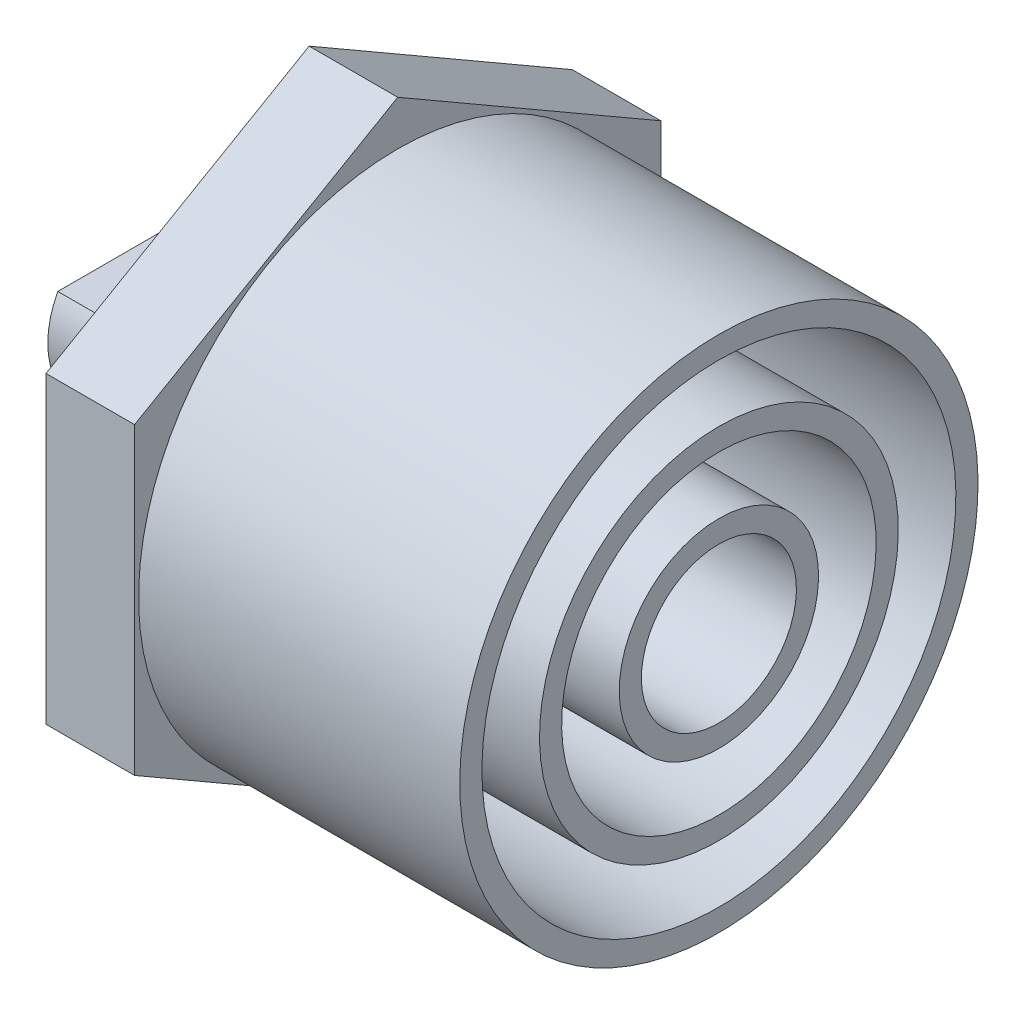
ISO-10303-21;
HEADER;
FILE_DESCRIPTION(('STEP AP214'),'2;1');
FILE_NAME('part.step','',(''),(''),'','','');
FILE_SCHEMA(('AUTOMOTIVE_DESIGN { 1 0 10303 214 1 1 1 1 }'));
ENDSEC;
DATA;
#1=APPLICATION_CONTEXT('core data for automotive mechanical design processes');
#2=APPLICATION_PROTOCOL_DEFINITION('international standard','automotive_design',2000,#1);
#3=PRODUCT_CONTEXT('',#1,'mechanical');
#4=PRODUCT('Part','Part','',(#3));
#5=PRODUCT_RELATED_PRODUCT_CATEGORY('part','',(#4));
#6=PRODUCT_DEFINITION_FORMATION('','',#4);
#7=PRODUCT_DEFINITION_CONTEXT('part definition',#1,'design');
#8=PRODUCT_DEFINITION('design','',#6,#7);
#9=PRODUCT_DEFINITION_SHAPE('','',#8);
#10=(LENGTH_UNIT() NAMED_UNIT(*) SI_UNIT(.MILLI.,.METRE.));
#11=(NAMED_UNIT(*) PLANE_ANGLE_UNIT() SI_UNIT($,.RADIAN.));
#12=(NAMED_UNIT(*) SI_UNIT($,.STERADIAN.) SOLID_ANGLE_UNIT());
#13=UNCERTAINTY_MEASURE_WITH_UNIT(LENGTH_MEASURE(1.E-05),#10,'distance_accuracy_value','');
#14=(GEOMETRIC_REPRESENTATION_CONTEXT(3) GLOBAL_UNCERTAINTY_ASSIGNED_CONTEXT((#13)) GLOBAL_UNIT_ASSIGNED_CONTEXT((#10,
#11,#12)) REPRESENTATION_CONTEXT('',''));
#15=CARTESIAN_POINT('',(0.,0.,0.));
#16=DIRECTION('',(0.,0.,1.));
#17=DIRECTION('',(1.,0.,0.));
#18=AXIS2_PLACEMENT_3D('',#15,#16,#17);
#19=CARTESIAN_POINT('',(-5.,0.899999999999999,1.9));
#20=DIRECTION('',(1.,0.,0.));
#21=DIRECTION('',(0.,1.,0.));
#22=AXIS2_PLACEMENT_3D('',#19,#20,#21);
#23=PLANE('',#22);
#24=CARTESIAN_POINT('',(-5.,0.,0.));
#25=DIRECTION('',(-1.,0.,0.));
#26=DIRECTION('',(0.,-1.,0.));
#27=AXIS2_PLACEMENT_3D('',#24,#25,#26);
#28=CIRCLE('',#27,1.9);
#29=CARTESIAN_POINT('',(-5.,0.899999999999999,-1.67332005306815));
#30=VERTEX_POINT('',#29);
#31=CARTESIAN_POINT('',(-5.,-0.9,-1.67332005306815));
#32=VERTEX_POINT('',#31);
#33=EDGE_CURVE('E165',#30,#32,#28,.T.);
#34=ORIENTED_EDGE('',*,*,#33,.T.);
#35=DIRECTION('',(0.,0.,-1.));
#36=VECTOR('',#35,1.);
#37=CARTESIAN_POINT('',(-5.,-0.9,1.9));
#38=LINE('',#37,#36);
#39=CARTESIAN_POINT('',(-5.,-0.9,1.67332005306815));
#40=VERTEX_POINT('',#39);
#41=EDGE_CURVE('E169',#40,#32,#38,.T.);
#42=ORIENTED_EDGE('',*,*,#41,.F.);
#43=CARTESIAN_POINT('',(-5.,0.,0.));
#44=DIRECTION('',(-1.,0.,0.));
#45=DIRECTION('',(0.,-1.,0.));
#46=AXIS2_PLACEMENT_3D('',#43,#44,#45);
#47=CIRCLE('',#46,1.9);
#48=CARTESIAN_POINT('',(-5.,0.899999999999999,1.67332005306815));
#49=VERTEX_POINT('',#48);
#50=EDGE_CURVE('E187',#40,#49,#47,.T.);
#51=ORIENTED_EDGE('',*,*,#50,.T.);
#52=DIRECTION('',(0.,0.,-1.));
#53=VECTOR('',#52,1.);
#54=CARTESIAN_POINT('',(-5.,0.899999999999999,1.9));
#55=LINE('',#54,#53);
#56=EDGE_CURVE('E171',#49,#30,#55,.T.);
#57=ORIENTED_EDGE('',*,*,#56,.T.);
#58=EDGE_LOOP('',(#34,#42,#51,#57));
#59=FACE_BOUND('',#58,.T.);
#60=ADVANCED_FACE('F87',(#59),#23,.F.);
#61=CARTESIAN_POINT('',(-5.,-0.9,1.9));
#62=DIRECTION('',(0.,1.,0.));
#63=DIRECTION('',(0.,0.,1.));
#64=AXIS2_PLACEMENT_3D('',#61,#62,#63);
#65=PLANE('',#64);
#66=DIRECTION('',(-1.,0.,0.));
#67=VECTOR('',#66,1.);
#68=CARTESIAN_POINT('',(-0.0718923562748617,-0.899999999999998,-1.67332005306815));
#69=LINE('',#68,#67);
#70=CARTESIAN_POINT('',(-1.,-0.899999999999999,-1.67332005306815));
#71=VERTEX_POINT('',#70);
#72=EDGE_CURVE('E180',#71,#32,#69,.T.);
#73=ORIENTED_EDGE('',*,*,#72,.F.);
#74=DIRECTION('',(0.,0.,-1.));
#75=VECTOR('',#74,1.);
#76=CARTESIAN_POINT('',(-1.,-0.9,1.9));
#77=LINE('',#76,#75);
#78=CARTESIAN_POINT('',(-1.,-0.899999999999999,1.67332005306815));
#79=VERTEX_POINT('',#78);
#80=EDGE_CURVE('E209',#79,#71,#77,.T.);
#81=ORIENTED_EDGE('',*,*,#80,.F.);
#82=DIRECTION('',(-1.,0.,0.));
#83=VECTOR('',#82,1.);
#84=CARTESIAN_POINT('',(-0.0718923562748617,-0.899999999999998,1.67332005306815));
#85=LINE('',#84,#83);
#86=EDGE_CURVE('E188',#79,#40,#85,.T.);
#87=ORIENTED_EDGE('',*,*,#86,.T.);
#88=ORIENTED_EDGE('',*,*,#41,.T.);
#89=EDGE_LOOP('',(#73,#81,#87,#88));
#90=FACE_BOUND('',#89,.T.);
#91=ADVANCED_FACE('F191',(#90),#65,.F.);
#92=CARTESIAN_POINT('',(-1.,0.900000000000002,1.9));
#93=DIRECTION('',(0.,-1.,0.));
#94=DIRECTION('',(1.,0.,0.));
#95=AXIS2_PLACEMENT_3D('',#92,#93,#94);
#96=PLANE('',#95);
#97=DIRECTION('',(-1.,0.,0.));
#98=VECTOR('',#97,1.);
#99=CARTESIAN_POINT('',(-0.0718923562748617,0.900000000000002,-1.67332005306815));
#100=LINE('',#99,#98);
#101=CARTESIAN_POINT('',(-1.,0.900000000000001,-1.67332005306815));
#102=VERTEX_POINT('',#101);
#103=EDGE_CURVE('E176',#102,#30,#100,.T.);
#104=ORIENTED_EDGE('',*,*,#103,.T.);
#105=ORIENTED_EDGE('',*,*,#56,.F.);
#106=DIRECTION('',(-1.,0.,0.));
#107=VECTOR('',#106,1.);
#108=CARTESIAN_POINT('',(-0.0718923562748617,0.900000000000002,1.67332005306815));
#109=LINE('',#108,#107);
#110=CARTESIAN_POINT('',(-1.,0.900000000000001,1.67332005306815));
#111=VERTEX_POINT('',#110);
#112=EDGE_CURVE('E203',#111,#49,#109,.T.);
#113=ORIENTED_EDGE('',*,*,#112,.F.);
#114=DIRECTION('',(0.,0.,-1.));
#115=VECTOR('',#114,1.);
#116=CARTESIAN_POINT('',(-1.,0.900000000000002,1.9));
#117=LINE('',#116,#115);
#118=EDGE_CURVE('E199',#111,#102,#117,.T.);
#119=ORIENTED_EDGE('',*,*,#118,.T.);
#120=EDGE_LOOP('',(#104,#105,#113,#119));
#121=FACE_BOUND('',#120,.T.);
#122=ADVANCED_FACE('F327',(#121),#96,.F.);
#123=CARTESIAN_POINT('',(1.,0.,0.));
#124=DIRECTION('',(1.,0.,0.));
#125=DIRECTION('',(0.,1.,0.));
#126=AXIS2_PLACEMENT_3D('',#123,#124,#125);
#127=CYLINDRICAL_SURFACE('',#126,5.85);
#128=CARTESIAN_POINT('',(8.25,0.,0.));
#129=DIRECTION('',(1.,0.,0.));
#130=DIRECTION('',(0.,1.,0.));
#131=AXIS2_PLACEMENT_3D('',#128,#129,#130);
#132=CIRCLE('',#131,5.85);
#133=CARTESIAN_POINT('',(8.25,5.85,0.));
#134=VERTEX_POINT('',#133);
#135=EDGE_CURVE('E12',#134,#134,#132,.T.);
#136=ORIENTED_EDGE('',*,*,#135,.F.);
#137=EDGE_LOOP('',(#136));
#138=FACE_BOUND('',#137,.T.);
#139=CARTESIAN_POINT('',(1.,0.,0.));
#140=DIRECTION('',(-1.,0.,0.));
#141=DIRECTION('',(0.,-1.,0.));
#142=AXIS2_PLACEMENT_3D('',#139,#140,#141);
#143=CIRCLE('',#142,5.85);
#144=CARTESIAN_POINT('',(1.,-5.85,0.));
#145=VERTEX_POINT('',#144);
#146=EDGE_CURVE('E212',#145,#145,#143,.T.);
#147=ORIENTED_EDGE('',*,*,#146,.F.);
#148=EDGE_LOOP('',(#147));
#149=FACE_BOUND('',#148,.T.);
#150=ADVANCED_FACE('F89',(#138,#149),#127,.T.);
#151=CARTESIAN_POINT('',(8.25,5.85,0.));
#152=DIRECTION('',(1.,0.,0.));
#153=DIRECTION('',(0.,1.,0.));
#154=AXIS2_PLACEMENT_3D('',#151,#152,#153);
#155=PLANE('',#154);
#156=ORIENTED_EDGE('',*,*,#135,.T.);
#157=EDGE_LOOP('',(#156));
#158=FACE_BOUND('',#157,.T.);
#159=CARTESIAN_POINT('',(8.25,0.,0.));
#160=DIRECTION('',(1.,0.,0.));
#161=DIRECTION('',(0.,1.,0.));
#162=AXIS2_PLACEMENT_3D('',#159,#160,#161);
#163=CIRCLE('',#162,5.35);
#164=CARTESIAN_POINT('',(8.25,5.35,0.));
#165=VERTEX_POINT('',#164);
#166=EDGE_CURVE('E96',#165,#165,#163,.T.);
#167=ORIENTED_EDGE('',*,*,#166,.F.);
#168=EDGE_LOOP('',(#167));
#169=FACE_BOUND('',#168,.T.);
#170=ADVANCED_FACE('F318',(#158,#169),#155,.T.);
#171=CARTESIAN_POINT('',(1.,0.,0.));
#172=DIRECTION('',(1.,0.,0.));
#173=DIRECTION('',(0.,1.,0.));
#174=AXIS2_PLACEMENT_3D('',#171,#172,#173);
#175=CYLINDRICAL_SURFACE('',#174,5.35);
#176=ORIENTED_EDGE('',*,*,#166,.T.);
#177=EDGE_LOOP('',(#176));
#178=FACE_BOUND('',#177,.T.);
#179=CARTESIAN_POINT('',(0.999999999999999,0.,0.));
#180=DIRECTION('',(1.,0.,0.));
#181=DIRECTION('',(0.,1.,0.));
#182=AXIS2_PLACEMENT_3D('',#179,#180,#181);
#183=CIRCLE('',#182,5.35);
#184=CARTESIAN_POINT('',(0.999999999999999,5.35,0.));
#185=VERTEX_POINT('',#184);
#186=EDGE_CURVE('E306',#185,#185,#183,.T.);
#187=ORIENTED_EDGE('',*,*,#186,.F.);
#188=EDGE_LOOP('',(#187));
#189=FACE_BOUND('',#188,.T.);
#190=ADVANCED_FACE('F315',(#178,#189),#175,.F.);
#191=CARTESIAN_POINT('',(0.999999999999999,5.35,0.));
#192=DIRECTION('',(1.,0.,0.));
#193=DIRECTION('',(0.,1.,0.));
#194=AXIS2_PLACEMENT_3D('',#191,#192,#193);
#195=PLANE('',#194);
#196=ORIENTED_EDGE('',*,*,#186,.T.);
#197=EDGE_LOOP('',(#196));
#198=FACE_BOUND('',#197,.T.);
#199=CARTESIAN_POINT('',(0.999999999999999,0.,0.));
#200=DIRECTION('',(1.,0.,0.));
#201=DIRECTION('',(0.,1.,0.));
#202=AXIS2_PLACEMENT_3D('',#199,#200,#201);
#203=CIRCLE('',#202,4.05);
#204=CARTESIAN_POINT('',(0.999999999999999,4.05,0.));
#205=VERTEX_POINT('',#204);
#206=EDGE_CURVE('E302',#205,#205,#203,.T.);
#207=ORIENTED_EDGE('',*,*,#206,.F.);
#208=EDGE_LOOP('',(#207));
#209=FACE_BOUND('',#208,.T.);
#210=ADVANCED_FACE('F325',(#198,#209),#195,.T.);
#211=CARTESIAN_POINT('',(1.,0.,0.));
#212=DIRECTION('',(1.,0.,0.));
#213=DIRECTION('',(0.,1.,0.));
#214=AXIS2_PLACEMENT_3D('',#211,#212,#213);
#215=CYLINDRICAL_SURFACE('',#214,4.05);
#216=ORIENTED_EDGE('',*,*,#206,.T.);
#217=EDGE_LOOP('',(#216));
#218=FACE_BOUND('',#217,.T.);
#219=CARTESIAN_POINT('',(8.25,0.,0.));
#220=DIRECTION('',(1.,0.,0.));
#221=DIRECTION('',(0.,1.,0.));
#222=AXIS2_PLACEMENT_3D('',#219,#220,#221);
#223=CIRCLE('',#222,4.05);
#224=CARTESIAN_POINT('',(8.25,4.05,0.));
#225=VERTEX_POINT('',#224);
#226=EDGE_CURVE('E298',#225,#225,#223,.T.);
#227=ORIENTED_EDGE('',*,*,#226,.F.);
#228=EDGE_LOOP('',(#227));
#229=FACE_BOUND('',#228,.T.);
#230=ADVANCED_FACE('F401',(#218,#229),#215,.T.);
#231=CARTESIAN_POINT('',(8.25,4.05,0.));
#232=DIRECTION('',(1.,0.,0.));
#233=DIRECTION('',(0.,1.,0.));
#234=AXIS2_PLACEMENT_3D('',#231,#232,#233);
#235=PLANE('',#234);
#236=ORIENTED_EDGE('',*,*,#226,.T.);
#237=EDGE_LOOP('',(#236));
#238=FACE_BOUND('',#237,.T.);
#239=CARTESIAN_POINT('',(8.25,0.,0.));
#240=DIRECTION('',(1.,0.,0.));
#241=DIRECTION('',(0.,1.,0.));
#242=AXIS2_PLACEMENT_3D('',#239,#240,#241);
#243=CIRCLE('',#242,3.55);
#244=CARTESIAN_POINT('',(8.25,3.55,0.));
#245=VERTEX_POINT('',#244);
#246=EDGE_CURVE('E294',#245,#245,#243,.T.);
#247=ORIENTED_EDGE('',*,*,#246,.F.);
#248=EDGE_LOOP('',(#247));
#249=FACE_BOUND('',#248,.T.);
#250=ADVANCED_FACE('F397',(#238,#249),#235,.T.);
#251=CARTESIAN_POINT('',(1.,0.,0.));
#252=DIRECTION('',(1.,0.,0.));
#253=DIRECTION('',(0.,1.,0.));
#254=AXIS2_PLACEMENT_3D('',#251,#252,#253);
#255=CYLINDRICAL_SURFACE('',#254,3.55);
#256=ORIENTED_EDGE('',*,*,#246,.T.);
#257=EDGE_LOOP('',(#256));
#258=FACE_BOUND('',#257,.T.);
#259=CARTESIAN_POINT('',(0.999999999999999,0.,0.));
#260=DIRECTION('',(1.,0.,0.));
#261=DIRECTION('',(0.,1.,0.));
#262=AXIS2_PLACEMENT_3D('',#259,#260,#261);
#263=CIRCLE('',#262,3.55);
#264=CARTESIAN_POINT('',(0.999999999999999,3.55,0.));
#265=VERTEX_POINT('',#264);
#266=EDGE_CURVE('E290',#265,#265,#263,.T.);
#267=ORIENTED_EDGE('',*,*,#266,.F.);
#268=EDGE_LOOP('',(#267));
#269=FACE_BOUND('',#268,.T.);
#270=ADVANCED_FACE('F393',(#258,#269),#255,.F.);
#271=CARTESIAN_POINT('',(0.999999999999999,3.55,0.));
#272=DIRECTION('',(1.,0.,0.));
#273=DIRECTION('',(0.,1.,0.));
#274=AXIS2_PLACEMENT_3D('',#271,#272,#273);
#275=PLANE('',#274);
#276=ORIENTED_EDGE('',*,*,#266,.T.);
#277=EDGE_LOOP('',(#276));
#278=FACE_BOUND('',#277,.T.);
#279=CARTESIAN_POINT('',(1.,0.,0.));
#280=DIRECTION('',(1.,0.,0.));
#281=DIRECTION('',(0.,1.,0.));
#282=AXIS2_PLACEMENT_3D('',#279,#280,#281);
#283=CIRCLE('',#282,2.25);
#284=CARTESIAN_POINT('',(1.,2.25,0.));
#285=VERTEX_POINT('',#284);
#286=EDGE_CURVE('E286',#285,#285,#283,.T.);
#287=ORIENTED_EDGE('',*,*,#286,.F.);
#288=EDGE_LOOP('',(#287));
#289=FACE_BOUND('',#288,.T.);
#290=ADVANCED_FACE('F389',(#278,#289),#275,.T.);
#291=CARTESIAN_POINT('',(1.,0.,0.));
#292=DIRECTION('',(1.,0.,0.));
#293=DIRECTION('',(0.,1.,0.));
#294=AXIS2_PLACEMENT_3D('',#291,#292,#293);
#295=CYLINDRICAL_SURFACE('',#294,2.25);
#296=ORIENTED_EDGE('',*,*,#286,.T.);
#297=EDGE_LOOP('',(#296));
#298=FACE_BOUND('',#297,.T.);
#299=CARTESIAN_POINT('',(8.25,0.,0.));
#300=DIRECTION('',(1.,0.,0.));
#301=DIRECTION('',(0.,1.,0.));
#302=AXIS2_PLACEMENT_3D('',#299,#300,#301);
#303=CIRCLE('',#302,2.25);
#304=CARTESIAN_POINT('',(8.25,2.25,0.));
#305=VERTEX_POINT('',#304);
#306=EDGE_CURVE('E282',#305,#305,#303,.T.);
#307=ORIENTED_EDGE('',*,*,#306,.F.);
#308=EDGE_LOOP('',(#307));
#309=FACE_BOUND('',#308,.T.);
#310=ADVANCED_FACE('F385',(#298,#309),#295,.T.);
#311=CARTESIAN_POINT('',(8.25,2.25,0.));
#312=DIRECTION('',(1.,0.,0.));
#313=DIRECTION('',(0.,1.,0.));
#314=AXIS2_PLACEMENT_3D('',#311,#312,#313);
#315=PLANE('',#314);
#316=ORIENTED_EDGE('',*,*,#306,.T.);
#317=EDGE_LOOP('',(#316));
#318=FACE_BOUND('',#317,.T.);
#319=CARTESIAN_POINT('',(8.25,0.,0.));
#320=DIRECTION('',(1.,0.,0.));
#321=DIRECTION('',(0.,1.,0.));
#322=AXIS2_PLACEMENT_3D('',#319,#320,#321);
#323=CIRCLE('',#322,1.75);
#324=CARTESIAN_POINT('',(8.25,1.75,0.));
#325=VERTEX_POINT('',#324);
#326=EDGE_CURVE('E278',#325,#325,#323,.T.);
#327=ORIENTED_EDGE('',*,*,#326,.F.);
#328=EDGE_LOOP('',(#327));
#329=FACE_BOUND('',#328,.T.);
#330=ADVANCED_FACE('F381',(#318,#329),#315,.T.);
#331=CARTESIAN_POINT('',(1.,0.,0.));
#332=DIRECTION('',(1.,0.,0.));
#333=DIRECTION('',(0.,1.,0.));
#334=AXIS2_PLACEMENT_3D('',#331,#332,#333);
#335=CYLINDRICAL_SURFACE('',#334,1.75);
#336=ORIENTED_EDGE('',*,*,#326,.T.);
#337=EDGE_LOOP('',(#336));
#338=FACE_BOUND('',#337,.T.);
#339=CARTESIAN_POINT('',(0.999999999999999,0.,0.));
#340=DIRECTION('',(1.,0.,0.));
#341=DIRECTION('',(0.,1.,0.));
#342=AXIS2_PLACEMENT_3D('',#339,#340,#341);
#343=CIRCLE('',#342,1.75);
#344=CARTESIAN_POINT('',(0.999999999999999,1.75,0.));
#345=VERTEX_POINT('',#344);
#346=EDGE_CURVE('E274',#345,#345,#343,.T.);
#347=ORIENTED_EDGE('',*,*,#346,.F.);
#348=EDGE_LOOP('',(#347));
#349=FACE_BOUND('',#348,.T.);
#350=ADVANCED_FACE('F377',(#338,#349),#335,.F.);
#351=CARTESIAN_POINT('',(1.,1.75,0.));
#352=DIRECTION('',(1.,0.,0.));
#353=DIRECTION('',(0.,1.,0.));
#354=AXIS2_PLACEMENT_3D('',#351,#352,#353);
#355=PLANE('',#354);
#356=ORIENTED_EDGE('',*,*,#346,.T.);
#357=EDGE_LOOP('',(#356));
#358=FACE_BOUND('',#357,.T.);
#359=ADVANCED_FACE('F346',(#358),#355,.T.);
#360=CARTESIAN_POINT('',(1.,0.,0.));
#361=DIRECTION('',(-1.,0.,0.));
#362=DIRECTION('',(0.,-1.,0.));
#363=AXIS2_PLACEMENT_3D('',#360,#361,#362);
#364=PLANE('',#363);
#365=ORIENTED_EDGE('',*,*,#146,.T.);
#366=EDGE_LOOP('',(#365));
#367=FACE_BOUND('',#366,.T.);
#368=DIRECTION('',(0.,1.,0.));
#369=VECTOR('',#368,1.);
#370=CARTESIAN_POINT('',(1.,0.,5.94));
#371=LINE('',#370,#369);
#372=CARTESIAN_POINT('',(1.,-3.42946059898638,5.94));
#373=VERTEX_POINT('',#372);
#374=CARTESIAN_POINT('',(1.,3.42946059898638,5.94));
#375=VERTEX_POINT('',#374);
#376=EDGE_CURVE('E216',#373,#375,#371,.T.);
#377=ORIENTED_EDGE('',*,*,#376,.F.);
#378=DIRECTION('',(0.,0.5,0.866025403784439));
#379=VECTOR('',#378,1.);
#380=CARTESIAN_POINT('',(1.,-5.14419089847956,2.97));
#381=LINE('',#380,#379);
#382=CARTESIAN_POINT('',(1.,-6.85892119797275,0.));
#383=VERTEX_POINT('',#382);
#384=EDGE_CURVE('E236',#383,#373,#381,.T.);
#385=ORIENTED_EDGE('',*,*,#384,.F.);
#386=DIRECTION('',(0.,-0.5,0.866025403784439));
#387=VECTOR('',#386,1.);
#388=CARTESIAN_POINT('',(1.,-5.14419089847956,-2.97));
#389=LINE('',#388,#387);
#390=CARTESIAN_POINT('',(1.,-3.42946059898638,-5.94));
#391=VERTEX_POINT('',#390);
#392=EDGE_CURVE('E232',#391,#383,#389,.T.);
#393=ORIENTED_EDGE('',*,*,#392,.F.);
#394=DIRECTION('',(0.,-1.,0.));
#395=VECTOR('',#394,1.);
#396=CARTESIAN_POINT('',(1.,0.,-5.94));
#397=LINE('',#396,#395);
#398=CARTESIAN_POINT('',(1.,3.42946059898638,-5.94));
#399=VERTEX_POINT('',#398);
#400=EDGE_CURVE('E228',#399,#391,#397,.T.);
#401=ORIENTED_EDGE('',*,*,#400,.F.);
#402=DIRECTION('',(0.,-0.5,-0.866025403784439));
#403=VECTOR('',#402,1.);
#404=CARTESIAN_POINT('',(1.,5.14419089847956,-2.97));
#405=LINE('',#404,#403);
#406=CARTESIAN_POINT('',(1.,6.85892119797275,0.));
#407=VERTEX_POINT('',#406);
#408=EDGE_CURVE('E224',#407,#399,#405,.T.);
#409=ORIENTED_EDGE('',*,*,#408,.F.);
#410=DIRECTION('',(0.,0.5,-0.866025403784439));
#411=VECTOR('',#410,1.);
#412=CARTESIAN_POINT('',(1.,5.14419089847957,2.97));
#413=LINE('',#412,#411);
#414=EDGE_CURVE('E220',#375,#407,#413,.T.);
#415=ORIENTED_EDGE('',*,*,#414,.F.);
#416=EDGE_LOOP('',(#377,#385,#393,#401,#409,#415));
#417=FACE_BOUND('',#416,.T.);
#418=ADVANCED_FACE('F342',(#367,#417),#364,.F.);
#419=CARTESIAN_POINT('',(-1.,0.,0.));
#420=DIRECTION('',(-1.,0.,0.));
#421=DIRECTION('',(0.,-1.,0.));
#422=AXIS2_PLACEMENT_3D('',#419,#420,#421);
#423=PLANE('',#422);
#424=ORIENTED_EDGE('',*,*,#80,.T.);
#425=CARTESIAN_POINT('',(-1.,0.,0.));
#426=DIRECTION('',(-1.,0.,0.));
#427=DIRECTION('',(0.,-1.,0.));
#428=AXIS2_PLACEMENT_3D('',#425,#426,#427);
#429=CIRCLE('',#428,1.9);
#430=EDGE_CURVE('E182',#71,#102,#429,.F.);
#431=ORIENTED_EDGE('',*,*,#430,.T.);
#432=ORIENTED_EDGE('',*,*,#118,.F.);
#433=CARTESIAN_POINT('',(-1.,0.,0.));
#434=DIRECTION('',(-1.,0.,0.));
#435=DIRECTION('',(0.,-1.,0.));
#436=AXIS2_PLACEMENT_3D('',#433,#434,#435);
#437=CIRCLE('',#436,1.9);
#438=EDGE_CURVE('E177',#111,#79,#437,.F.);
#439=ORIENTED_EDGE('',*,*,#438,.T.);
#440=EDGE_LOOP('',(#424,#431,#432,#439));
#441=FACE_BOUND('',#440,.T.);
#442=DIRECTION('',(0.,0.5,-0.866025403784439));
#443=VECTOR('',#442,1.);
#444=CARTESIAN_POINT('',(-1.,3.42946059898638,5.94));
#445=LINE('',#444,#443);
#446=CARTESIAN_POINT('',(-1.,3.42946059898638,5.94));
#447=VERTEX_POINT('',#446);
#448=CARTESIAN_POINT('',(-1.,6.85892119797275,0.));
#449=VERTEX_POINT('',#448);
#450=EDGE_CURVE('E240',#447,#449,#445,.T.);
#451=ORIENTED_EDGE('',*,*,#450,.T.);
#452=DIRECTION('',(0.,-0.5,-0.866025403784438));
#453=VECTOR('',#452,1.);
#454=CARTESIAN_POINT('',(-1.,6.85892119797275,0.));
#455=LINE('',#454,#453);
#456=CARTESIAN_POINT('',(-1.,3.42946059898638,-5.94));
#457=VERTEX_POINT('',#456);
#458=EDGE_CURVE('E243',#449,#457,#455,.T.);
#459=ORIENTED_EDGE('',*,*,#458,.T.);
#460=DIRECTION('',(0.,-1.,0.));
#461=VECTOR('',#460,1.);
#462=CARTESIAN_POINT('',(-1.,3.42946059898638,-5.94));
#463=LINE('',#462,#461);
#464=CARTESIAN_POINT('',(-1.,-3.42946059898638,-5.94));
#465=VERTEX_POINT('',#464);
#466=EDGE_CURVE('E246',#457,#465,#463,.T.);
#467=ORIENTED_EDGE('',*,*,#466,.T.);
#468=DIRECTION('',(0.,-0.5,0.866025403784439));
#469=VECTOR('',#468,1.);
#470=CARTESIAN_POINT('',(-1.,-3.42946059898638,-5.94));
#471=LINE('',#470,#469);
#472=CARTESIAN_POINT('',(-1.,-6.85892119797275,0.));
#473=VERTEX_POINT('',#472);
#474=EDGE_CURVE('E249',#465,#473,#471,.T.);
#475=ORIENTED_EDGE('',*,*,#474,.T.);
#476=DIRECTION('',(0.,0.5,0.866025403784439));
#477=VECTOR('',#476,1.);
#478=CARTESIAN_POINT('',(-1.,-6.85892119797275,0.));
#479=LINE('',#478,#477);
#480=CARTESIAN_POINT('',(-1.,-3.42946059898638,5.94));
#481=VERTEX_POINT('',#480);
#482=EDGE_CURVE('E108',#473,#481,#479,.T.);
#483=ORIENTED_EDGE('',*,*,#482,.T.);
#484=DIRECTION('',(0.,1.,0.));
#485=VECTOR('',#484,1.);
#486=CARTESIAN_POINT('',(-1.,-3.42946059898638,5.94));
#487=LINE('',#486,#485);
#488=EDGE_CURVE('E103',#481,#447,#487,.T.);
#489=ORIENTED_EDGE('',*,*,#488,.T.);
#490=EDGE_LOOP('',(#451,#459,#467,#475,#483,#489));
#491=FACE_BOUND('',#490,.T.);
#492=ADVANCED_FACE('F345',(#441,#491),#423,.T.);
#493=CARTESIAN_POINT('',(-1.,3.42946059898638,5.94));
#494=DIRECTION('',(0.,-0.866025403784439,-0.5));
#495=DIRECTION('',(0.,0.5,-0.866025403784439));
#496=AXIS2_PLACEMENT_3D('',#493,#494,#495);
#497=PLANE('',#496);
#498=DIRECTION('',(1.,0.,0.));
#499=VECTOR('',#498,1.);
#500=CARTESIAN_POINT('',(-1.,3.42946059898638,5.94));
#501=LINE('',#500,#499);
#502=EDGE_CURVE('E256',#447,#375,#501,.T.);
#503=ORIENTED_EDGE('',*,*,#502,.T.);
#504=ORIENTED_EDGE('',*,*,#414,.T.);
#505=DIRECTION('',(1.,0.,0.));
#506=VECTOR('',#505,1.);
#507=CARTESIAN_POINT('',(-1.,6.85892119797275,0.));
#508=LINE('',#507,#506);
#509=EDGE_CURVE('E271',#449,#407,#508,.T.);
#510=ORIENTED_EDGE('',*,*,#509,.F.);
#511=ORIENTED_EDGE('',*,*,#450,.F.);
#512=EDGE_LOOP('',(#503,#504,#510,#511));
#513=FACE_BOUND('',#512,.T.);
#514=ADVANCED_FACE('F350',(#513),#497,.F.);
#515=CARTESIAN_POINT('',(-1.,6.85892119797275,0.));
#516=DIRECTION('',(0.,-0.866025403784438,0.5));
#517=DIRECTION('',(0.,-0.5,-0.866025403784439));
#518=AXIS2_PLACEMENT_3D('',#515,#516,#517);
#519=PLANE('',#518);
#520=ORIENTED_EDGE('',*,*,#509,.T.);
#521=ORIENTED_EDGE('',*,*,#408,.T.);
#522=DIRECTION('',(1.,0.,0.));
#523=VECTOR('',#522,1.);
#524=CARTESIAN_POINT('',(-1.,3.42946059898638,-5.94));
#525=LINE('',#524,#523);
#526=EDGE_CURVE('E268',#457,#399,#525,.T.);
#527=ORIENTED_EDGE('',*,*,#526,.F.);
#528=ORIENTED_EDGE('',*,*,#458,.F.);
#529=EDGE_LOOP('',(#520,#521,#527,#528));
#530=FACE_BOUND('',#529,.T.);
#531=ADVANCED_FACE('F367',(#530),#519,.F.);
#532=CARTESIAN_POINT('',(-1.,3.42946059898638,-5.94));
#533=DIRECTION('',(0.,0.,1.));
#534=DIRECTION('',(0.,-1.,0.));
#535=AXIS2_PLACEMENT_3D('',#532,#533,#534);
#536=PLANE('',#535);
#537=ORIENTED_EDGE('',*,*,#526,.T.);
#538=ORIENTED_EDGE('',*,*,#400,.T.);
#539=DIRECTION('',(1.,0.,0.));
#540=VECTOR('',#539,1.);
#541=CARTESIAN_POINT('',(-1.,-3.42946059898638,-5.94));
#542=LINE('',#541,#540);
#543=EDGE_CURVE('E265',#465,#391,#542,.T.);
#544=ORIENTED_EDGE('',*,*,#543,.F.);
#545=ORIENTED_EDGE('',*,*,#466,.F.);
#546=EDGE_LOOP('',(#537,#538,#544,#545));
#547=FACE_BOUND('',#546,.T.);
#548=ADVANCED_FACE('F363',(#547),#536,.F.);
#549=CARTESIAN_POINT('',(-1.,-3.42946059898638,-5.94));
#550=DIRECTION('',(0.,0.866025403784439,0.5));
#551=DIRECTION('',(0.,-0.5,0.866025403784439));
#552=AXIS2_PLACEMENT_3D('',#549,#550,#551);
#553=PLANE('',#552);
#554=ORIENTED_EDGE('',*,*,#543,.T.);
#555=ORIENTED_EDGE('',*,*,#392,.T.);
#556=DIRECTION('',(1.,0.,0.));
#557=VECTOR('',#556,1.);
#558=CARTESIAN_POINT('',(-1.,-6.85892119797275,0.));
#559=LINE('',#558,#557);
#560=EDGE_CURVE('E262',#473,#383,#559,.T.);
#561=ORIENTED_EDGE('',*,*,#560,.F.);
#562=ORIENTED_EDGE('',*,*,#474,.F.);
#563=EDGE_LOOP('',(#554,#555,#561,#562));
#564=FACE_BOUND('',#563,.T.);
#565=ADVANCED_FACE('F359',(#564),#553,.F.);
#566=CARTESIAN_POINT('',(-1.,-6.85892119797275,0.));
#567=DIRECTION('',(0.,0.866025403784438,-0.5));
#568=DIRECTION('',(0.,0.5,0.866025403784439));
#569=AXIS2_PLACEMENT_3D('',#566,#567,#568);
#570=PLANE('',#569);
#571=ORIENTED_EDGE('',*,*,#560,.T.);
#572=ORIENTED_EDGE('',*,*,#384,.T.);
#573=DIRECTION('',(1.,0.,0.));
#574=VECTOR('',#573,1.);
#575=CARTESIAN_POINT('',(-1.,-3.42946059898638,5.94));
#576=LINE('',#575,#574);
#577=EDGE_CURVE('E259',#481,#373,#576,.T.);
#578=ORIENTED_EDGE('',*,*,#577,.F.);
#579=ORIENTED_EDGE('',*,*,#482,.F.);
#580=EDGE_LOOP('',(#571,#572,#578,#579));
#581=FACE_BOUND('',#580,.T.);
#582=ADVANCED_FACE('F355',(#581),#570,.F.);
#583=CARTESIAN_POINT('',(-1.,-3.42946059898638,5.94));
#584=DIRECTION('',(0.,0.,-1.));
#585=DIRECTION('',(0.,1.,0.));
#586=AXIS2_PLACEMENT_3D('',#583,#584,#585);
#587=PLANE('',#586);
#588=ORIENTED_EDGE('',*,*,#577,.T.);
#589=ORIENTED_EDGE('',*,*,#376,.T.);
#590=ORIENTED_EDGE('',*,*,#502,.F.);
#591=ORIENTED_EDGE('',*,*,#488,.F.);
#592=EDGE_LOOP('',(#588,#589,#590,#591));
#593=FACE_BOUND('',#592,.T.);
#594=ADVANCED_FACE('F352',(#593),#587,.F.);
#595=CARTESIAN_POINT('',(-0.0718923562748617,0.,0.));
#596=DIRECTION('',(-1.,0.,0.));
#597=DIRECTION('',(0.,-1.,0.));
#598=AXIS2_PLACEMENT_3D('',#595,#596,#597);
#599=CYLINDRICAL_SURFACE('',#598,1.9);
#600=ORIENTED_EDGE('',*,*,#430,.F.);
#601=ORIENTED_EDGE('',*,*,#72,.T.);
#602=ORIENTED_EDGE('',*,*,#33,.F.);
#603=ORIENTED_EDGE('',*,*,#103,.F.);
#604=EDGE_LOOP('',(#600,#601,#602,#603));
#605=FACE_BOUND('',#604,.T.);
#606=ADVANCED_FACE('F181',(#605),#599,.T.);
#607=CARTESIAN_POINT('',(-0.0718923562748617,0.,0.));
#608=DIRECTION('',(-1.,0.,0.));
#609=DIRECTION('',(0.,-1.,0.));
#610=AXIS2_PLACEMENT_3D('',#607,#608,#609);
#611=CYLINDRICAL_SURFACE('',#610,1.9);
#612=ORIENTED_EDGE('',*,*,#112,.T.);
#613=ORIENTED_EDGE('',*,*,#50,.F.);
#614=ORIENTED_EDGE('',*,*,#86,.F.);
#615=ORIENTED_EDGE('',*,*,#438,.F.);
#616=EDGE_LOOP('',(#612,#613,#614,#615));
#617=FACE_BOUND('',#616,.T.);
#618=ADVANCED_FACE('F337',(#617),#611,.T.);
#619=CLOSED_SHELL('',(#60,#91,#122,#150,#170,#190,#210,#230,#250,#270,#290,#310,#330,#350,#359,
#418,#492,#514,#531,#548,#565,#582,#594,#606,#618));
#620=MANIFOLD_SOLID_BREP('B2',#619);
#621=ADVANCED_BREP_SHAPE_REPRESENTATION('',(#18,#620),#14);
#622=SHAPE_DEFINITION_REPRESENTATION(#9,#621);
ENDSEC;
END-ISO-10303-21;
